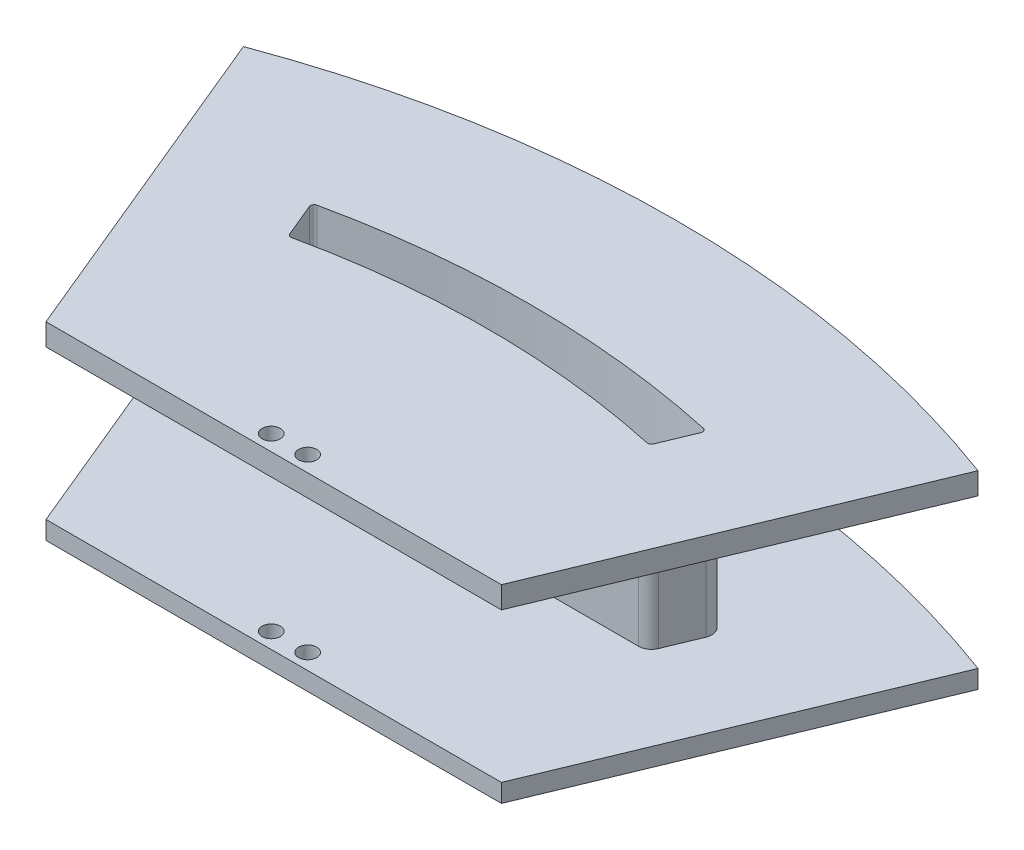
ISO-10303-21;
HEADER;
FILE_DESCRIPTION(('STEP AP214'),'2;1');
FILE_NAME('part.step','',(''),(''),'','','');
FILE_SCHEMA(('AUTOMOTIVE_DESIGN { 1 0 10303 214 1 1 1 1 }'));
ENDSEC;
DATA;
#1=APPLICATION_CONTEXT('core data for automotive mechanical design processes');
#2=APPLICATION_PROTOCOL_DEFINITION('international standard','automotive_design',2000,#1);
#3=PRODUCT_CONTEXT('',#1,'mechanical');
#4=PRODUCT('Part','Part','',(#3));
#5=PRODUCT_RELATED_PRODUCT_CATEGORY('part','',(#4));
#6=PRODUCT_DEFINITION_FORMATION('','',#4);
#7=PRODUCT_DEFINITION_CONTEXT('part definition',#1,'design');
#8=PRODUCT_DEFINITION('design','',#6,#7);
#9=PRODUCT_DEFINITION_SHAPE('','',#8);
#10=(LENGTH_UNIT() NAMED_UNIT(*) SI_UNIT(.MILLI.,.METRE.));
#11=(NAMED_UNIT(*) PLANE_ANGLE_UNIT() SI_UNIT($,.RADIAN.));
#12=(NAMED_UNIT(*) SI_UNIT($,.STERADIAN.) SOLID_ANGLE_UNIT());
#13=UNCERTAINTY_MEASURE_WITH_UNIT(LENGTH_MEASURE(1.E-05),#10,'distance_accuracy_value','');
#14=(GEOMETRIC_REPRESENTATION_CONTEXT(3) GLOBAL_UNCERTAINTY_ASSIGNED_CONTEXT((#13)) GLOBAL_UNIT_ASSIGNED_CONTEXT((#10,
#11,#12)) REPRESENTATION_CONTEXT('',''));
#15=CARTESIAN_POINT('',(0.,0.,0.));
#16=DIRECTION('',(0.,0.,1.));
#17=DIRECTION('',(1.,0.,0.));
#18=AXIS2_PLACEMENT_3D('',#15,#16,#17);
#19=CARTESIAN_POINT('',(0.,0.,-1.38777878078145E-13));
#20=DIRECTION('',(0.,-1.,0.));
#21=DIRECTION('',(0.,0.,-1.));
#22=AXIS2_PLACEMENT_3D('',#19,#20,#21);
#23=PLANE('',#22);
#24=CARTESIAN_POINT('',(0.,0.,-1.38777878078145E-13));
#25=DIRECTION('',(0.,-1.,0.));
#26=DIRECTION('',(0.,0.,-1.));
#27=AXIS2_PLACEMENT_3D('',#24,#25,#26);
#28=CIRCLE('',#27,145.);
#29=CARTESIAN_POINT('',(-50.404915860436,0.,-135.957141986371));
#30=VERTEX_POINT('',#29);
#31=CARTESIAN_POINT('',(50.404915860436,0.,-135.957141986371));
#32=VERTEX_POINT('',#31);
#33=EDGE_CURVE('E524',#30,#32,#28,.T.);
#34=ORIENTED_EDGE('',*,*,#33,.F.);
#35=DIRECTION('',(0.382683432365084,0.,0.92387953251129));
#36=VECTOR('',#35,1.);
#37=CARTESIAN_POINT('',(-50.404915860436,0.,-135.957141986371));
#38=LINE('',#37,#36);
#39=CARTESIAN_POINT('',(-31.25,0.,-89.7130843299906));
#40=VERTEX_POINT('',#39);
#41=EDGE_CURVE('E531',#30,#40,#38,.T.);
#42=ORIENTED_EDGE('',*,*,#41,.T.);
#43=DIRECTION('',(1.,0.,0.));
#44=VECTOR('',#43,1.);
#45=CARTESIAN_POINT('',(-31.25,0.,-89.7130843299906));
#46=LINE('',#45,#44);
#47=CARTESIAN_POINT('',(31.25,0.,-89.7130843299906));
#48=VERTEX_POINT('',#47);
#49=EDGE_CURVE('E545',#40,#48,#46,.T.);
#50=ORIENTED_EDGE('',*,*,#49,.T.);
#51=DIRECTION('',(-0.382683432365084,0.,0.92387953251129));
#52=VECTOR('',#51,1.);
#53=CARTESIAN_POINT('',(50.404915860436,0.,-135.957141986371));
#54=LINE('',#53,#52);
#55=EDGE_CURVE('E542',#32,#48,#54,.T.);
#56=ORIENTED_EDGE('',*,*,#55,.F.);
#57=EDGE_LOOP('',(#34,#42,#50,#56));
#58=FACE_BOUND('',#57,.T.);
#59=CARTESIAN_POINT('',(2.5,0.,-91.8683298050514));
#60=DIRECTION('',(0.,1.,0.));
#61=DIRECTION('',(0.,0.,1.));
#62=AXIS2_PLACEMENT_3D('',#59,#60,#61);
#63=CIRCLE('',#62,1.25);
#64=CARTESIAN_POINT('',(2.5,0.,-90.6183298050514));
#65=VERTEX_POINT('',#64);
#66=EDGE_CURVE('E520',#65,#65,#63,.F.);
#67=ORIENTED_EDGE('',*,*,#66,.T.);
#68=EDGE_LOOP('',(#67));
#69=FACE_BOUND('',#68,.T.);
#70=CARTESIAN_POINT('',(-2.5,0.,-91.8683298050514));
#71=DIRECTION('',(0.,1.,0.));
#72=DIRECTION('',(0.,0.,1.));
#73=AXIS2_PLACEMENT_3D('',#70,#71,#72);
#74=CIRCLE('',#73,1.25);
#75=CARTESIAN_POINT('',(-2.5,0.,-90.6183298050514));
#76=VERTEX_POINT('',#75);
#77=EDGE_CURVE('E479',#76,#76,#74,.T.);
#78=ORIENTED_EDGE('',*,*,#77,.F.);
#79=EDGE_LOOP('',(#78));
#80=FACE_BOUND('',#79,.T.);
#81=DIRECTION('',(0.382683432365085,0.,-0.923879532511289));
#82=VECTOR('',#81,1.);
#83=CARTESIAN_POINT('',(-18.857614350314,0.,-7.81107961790158));
#84=LINE('',#83,#82);
#85=CARTESIAN_POINT('',(26.112179792791,0.,-116.377766535313));
#86=VERTEX_POINT('',#85);
#87=CARTESIAN_POINT('',(28.0255969546164,0.,-120.99716419787));
#88=VERTEX_POINT('',#87);
#89=EDGE_CURVE('E221',#86,#88,#84,.T.);
#90=ORIENTED_EDGE('',*,*,#89,.F.);
#91=CARTESIAN_POINT('',(24.4953906108962,0.,-117.047462541952));
#92=DIRECTION('',(0.,-1.,0.));
#93=DIRECTION('',(0.,0.,-1.));
#94=AXIS2_PLACEMENT_3D('',#91,#92,#93);
#95=CIRCLE('',#94,1.75000000000001);
#96=CARTESIAN_POINT('',(24.4953906108962,0.,-115.297462541952));
#97=VERTEX_POINT('',#96);
#98=EDGE_CURVE('E558',#86,#97,#95,.T.);
#99=ORIENTED_EDGE('',*,*,#98,.T.);
#100=DIRECTION('',(-1.,0.,0.));
#101=VECTOR('',#100,1.);
#102=CARTESIAN_POINT('',(0.,0.,-115.297462541952));
#103=LINE('',#102,#101);
#104=CARTESIAN_POINT('',(-24.4953906108962,0.,-115.297462541952));
#105=VERTEX_POINT('',#104);
#106=EDGE_CURVE('E561',#97,#105,#103,.T.);
#107=ORIENTED_EDGE('',*,*,#106,.T.);
#108=CARTESIAN_POINT('',(-24.4953906108962,0.,-117.047462541952));
#109=DIRECTION('',(0.,-1.,0.));
#110=DIRECTION('',(0.,0.,-1.));
#111=AXIS2_PLACEMENT_3D('',#108,#109,#110);
#112=CIRCLE('',#111,1.75);
#113=CARTESIAN_POINT('',(-26.112179792791,0.,-116.377766535313));
#114=VERTEX_POINT('',#113);
#115=EDGE_CURVE('E564',#105,#114,#112,.T.);
#116=ORIENTED_EDGE('',*,*,#115,.T.);
#117=DIRECTION('',(-0.382683432365087,0.,-0.923879532511288));
#118=VECTOR('',#117,1.);
#119=CARTESIAN_POINT('',(18.8576143503142,0.,-7.81107961790172));
#120=LINE('',#119,#118);
#121=CARTESIAN_POINT('',(-28.0255969546164,0.,-120.99716419787));
#122=VERTEX_POINT('',#121);
#123=EDGE_CURVE('E567',#114,#122,#120,.T.);
#124=ORIENTED_EDGE('',*,*,#123,.T.);
#125=CARTESIAN_POINT('',(-26.4088077727217,0.,-121.666860204509));
#126=DIRECTION('',(0.,-1.,0.));
#127=DIRECTION('',(0.,0.,-1.));
#128=AXIS2_PLACEMENT_3D('',#125,#126,#127);
#129=CIRCLE('',#128,1.75);
#130=CARTESIAN_POINT('',(-26.7800159141053,0.,-123.377036954371));
#131=VERTEX_POINT('',#130);
#132=EDGE_CURVE('E570',#122,#131,#129,.T.);
#133=ORIENTED_EDGE('',*,*,#132,.T.);
#134=CARTESIAN_POINT('',(0.,0.,-1.38777878078145E-13));
#135=DIRECTION('',(0.,-1.,0.));
#136=DIRECTION('',(0.,0.,-1.));
#137=AXIS2_PLACEMENT_3D('',#134,#135,#136);
#138=CIRCLE('',#137,126.25);
#139=CARTESIAN_POINT('',(26.7800159141053,0.,-123.377036954371));
#140=VERTEX_POINT('',#139);
#141=EDGE_CURVE('E573',#131,#140,#138,.T.);
#142=ORIENTED_EDGE('',*,*,#141,.T.);
#143=CARTESIAN_POINT('',(26.4088077727216,0.,-121.666860204509));
#144=DIRECTION('',(0.,-1.,0.));
#145=DIRECTION('',(0.,0.,-1.));
#146=AXIS2_PLACEMENT_3D('',#143,#144,#145);
#147=CIRCLE('',#146,1.75);
#148=EDGE_CURVE('E576',#140,#88,#147,.T.);
#149=ORIENTED_EDGE('',*,*,#148,.T.);
#150=EDGE_LOOP('',(#90,#99,#107,#116,#124,#133,#142,#149));
#151=FACE_BOUND('',#150,.T.);
#152=ADVANCED_FACE('F213',(#58,#69,#80,#151),#23,.F.);
#153=CARTESIAN_POINT('',(0.,-2.5,-1.38777878078145E-13));
#154=DIRECTION('',(0.,-1.,0.));
#155=DIRECTION('',(0.,0.,-1.));
#156=AXIS2_PLACEMENT_3D('',#153,#154,#155);
#157=PLANE('',#156);
#158=CARTESIAN_POINT('',(0.,-2.5,-4.17485364670413));
#159=DIRECTION('',(0.,1.,0.));
#160=DIRECTION('',(0.,0.,1.));
#161=AXIS2_PLACEMENT_3D('',#158,#159,#160);
#162=CIRCLE('',#161,115.);
#163=CARTESIAN_POINT('',(24.389349958901,-2.5,-116.558836529419));
#164=VERTEX_POINT('',#163);
#165=CARTESIAN_POINT('',(-24.389349958901,-2.5,-116.558836529419));
#166=VERTEX_POINT('',#165);
#167=EDGE_CURVE('E487',#164,#166,#162,.T.);
#168=ORIENTED_EDGE('',*,*,#167,.F.);
#169=CARTESIAN_POINT('',(24.4953906108962,-2.5,-117.047462541952));
#170=DIRECTION('',(0.,-1.,0.));
#171=DIRECTION('',(0.,0.,-1.));
#172=AXIS2_PLACEMENT_3D('',#169,#170,#171);
#173=CIRCLE('',#172,0.499999999999993);
#174=CARTESIAN_POINT('',(24.9573303771519,-2.5,-116.85612082577));
#175=VERTEX_POINT('',#174);
#176=EDGE_CURVE('E483',#175,#164,#173,.T.);
#177=ORIENTED_EDGE('',*,*,#176,.F.);
#178=DIRECTION('',(-0.382683432365086,0.,0.923879532511288));
#179=VECTOR('',#178,1.);
#180=CARTESIAN_POINT('',(26.8707475389773,-2.5,-121.475518488326));
#181=LINE('',#180,#179);
#182=CARTESIAN_POINT('',(26.8707475389773,-2.5,-121.475518488326));
#183=VERTEX_POINT('',#182);
#184=EDGE_CURVE('E502',#183,#175,#181,.T.);
#185=ORIENTED_EDGE('',*,*,#184,.F.);
#186=CARTESIAN_POINT('',(26.4088077727216,-2.5,-121.666860204509));
#187=DIRECTION('',(0.,-1.,0.));
#188=DIRECTION('',(0.,0.,-1.));
#189=AXIS2_PLACEMENT_3D('',#186,#187,#188);
#190=CIRCLE('',#189,0.500000000000013);
#191=CARTESIAN_POINT('',(26.5148672416884,-2.5,-122.155482133041));
#192=VERTEX_POINT('',#191);
#193=EDGE_CURVE('E499',#192,#183,#190,.T.);
#194=ORIENTED_EDGE('',*,*,#193,.F.);
#195=CARTESIAN_POINT('',(0.,-2.5,-1.38777878078145E-13));
#196=DIRECTION('',(0.,-1.,0.));
#197=DIRECTION('',(0.,0.,-1.));
#198=AXIS2_PLACEMENT_3D('',#195,#196,#197);
#199=CIRCLE('',#198,125.);
#200=CARTESIAN_POINT('',(-26.5148672416884,-2.5,-122.155482133041));
#201=VERTEX_POINT('',#200);
#202=EDGE_CURVE('E497',#201,#192,#199,.T.);
#203=ORIENTED_EDGE('',*,*,#202,.F.);
#204=CARTESIAN_POINT('',(-26.4088077727217,-2.5,-121.666860204509));
#205=DIRECTION('',(0.,-1.,0.));
#206=DIRECTION('',(0.,0.,-1.));
#207=AXIS2_PLACEMENT_3D('',#204,#205,#206);
#208=CIRCLE('',#207,0.499999999999998);
#209=CARTESIAN_POINT('',(-26.8707475389773,-2.5,-121.475518488326));
#210=VERTEX_POINT('',#209);
#211=EDGE_CURVE('E495',#210,#201,#208,.T.);
#212=ORIENTED_EDGE('',*,*,#211,.F.);
#213=DIRECTION('',(0.382683432365085,0.,0.923879532511289));
#214=VECTOR('',#213,1.);
#215=CARTESIAN_POINT('',(-26.8707475389773,-2.5,-121.475518488326));
#216=LINE('',#215,#214);
#217=CARTESIAN_POINT('',(-24.9573303771519,-2.5,-116.85612082577));
#218=VERTEX_POINT('',#217);
#219=EDGE_CURVE('E492',#210,#218,#216,.T.);
#220=ORIENTED_EDGE('',*,*,#219,.T.);
#221=CARTESIAN_POINT('',(-24.4953906108962,-2.5,-117.047462541952));
#222=DIRECTION('',(0.,1.,0.));
#223=DIRECTION('',(0.,0.,1.));
#224=AXIS2_PLACEMENT_3D('',#221,#222,#223);
#225=CIRCLE('',#224,0.49999999999999);
#226=EDGE_CURVE('E489',#218,#166,#225,.T.);
#227=ORIENTED_EDGE('',*,*,#226,.T.);
#228=EDGE_LOOP('',(#168,#177,#185,#194,#203,#212,#220,#227));
#229=FACE_BOUND('',#228,.T.);
#230=CARTESIAN_POINT('',(2.5,-2.5,-91.8683298050514));
#231=DIRECTION('',(0.,1.,0.));
#232=DIRECTION('',(0.,0.,1.));
#233=AXIS2_PLACEMENT_3D('',#230,#231,#232);
#234=CIRCLE('',#233,1.25);
#235=CARTESIAN_POINT('',(2.5,-2.5,-90.6183298050514));
#236=VERTEX_POINT('',#235);
#237=EDGE_CURVE('E521',#236,#236,#234,.F.);
#238=ORIENTED_EDGE('',*,*,#237,.F.);
#239=EDGE_LOOP('',(#238));
#240=FACE_BOUND('',#239,.T.);
#241=CARTESIAN_POINT('',(0.,-2.5,-1.38777878078145E-13));
#242=DIRECTION('',(0.,-1.,0.));
#243=DIRECTION('',(0.,0.,-1.));
#244=AXIS2_PLACEMENT_3D('',#241,#242,#243);
#245=CIRCLE('',#244,145.);
#246=CARTESIAN_POINT('',(-50.404915860436,-2.5,-135.957141986371));
#247=VERTEX_POINT('',#246);
#248=CARTESIAN_POINT('',(50.404915860436,-2.5,-135.957141986371));
#249=VERTEX_POINT('',#248);
#250=EDGE_CURVE('E527',#247,#249,#245,.T.);
#251=ORIENTED_EDGE('',*,*,#250,.T.);
#252=DIRECTION('',(-0.382683432365084,0.,0.92387953251129));
#253=VECTOR('',#252,1.);
#254=CARTESIAN_POINT('',(50.404915860436,-2.5,-135.957141986371));
#255=LINE('',#254,#253);
#256=CARTESIAN_POINT('',(31.25,-2.5,-89.7130843299906));
#257=VERTEX_POINT('',#256);
#258=EDGE_CURVE('E530',#249,#257,#255,.T.);
#259=ORIENTED_EDGE('',*,*,#258,.T.);
#260=DIRECTION('',(1.,0.,0.));
#261=VECTOR('',#260,1.);
#262=CARTESIAN_POINT('',(-31.25,-2.5,-89.7130843299906));
#263=LINE('',#262,#261);
#264=CARTESIAN_POINT('',(-31.25,-2.5,-89.7130843299906));
#265=VERTEX_POINT('',#264);
#266=EDGE_CURVE('E533',#265,#257,#263,.T.);
#267=ORIENTED_EDGE('',*,*,#266,.F.);
#268=DIRECTION('',(0.382683432365084,0.,0.92387953251129));
#269=VECTOR('',#268,1.);
#270=CARTESIAN_POINT('',(-50.404915860436,-2.5,-135.957141986371));
#271=LINE('',#270,#269);
#272=EDGE_CURVE('E536',#247,#265,#271,.T.);
#273=ORIENTED_EDGE('',*,*,#272,.F.);
#274=EDGE_LOOP('',(#251,#259,#267,#273));
#275=FACE_BOUND('',#274,.T.);
#276=CARTESIAN_POINT('',(-2.5,-2.5,-91.8683298050514));
#277=DIRECTION('',(0.,1.,0.));
#278=DIRECTION('',(0.,0.,1.));
#279=AXIS2_PLACEMENT_3D('',#276,#277,#278);
#280=CIRCLE('',#279,1.25);
#281=CARTESIAN_POINT('',(-2.5,-2.5,-90.6183298050514));
#282=VERTEX_POINT('',#281);
#283=EDGE_CURVE('E480',#282,#282,#280,.T.);
#284=ORIENTED_EDGE('',*,*,#283,.T.);
#285=EDGE_LOOP('',(#284));
#286=FACE_BOUND('',#285,.T.);
#287=ADVANCED_FACE('F617',(#229,#240,#275,#286),#157,.T.);
#288=CARTESIAN_POINT('',(0.,-2.5,-1.38777878078145E-13));
#289=DIRECTION('',(0.,1.,0.));
#290=DIRECTION('',(0.,0.,1.));
#291=AXIS2_PLACEMENT_3D('',#288,#289,#290);
#292=CYLINDRICAL_SURFACE('',#291,145.);
#293=ORIENTED_EDGE('',*,*,#33,.T.);
#294=DIRECTION('',(0.,1.,0.));
#295=VECTOR('',#294,1.);
#296=CARTESIAN_POINT('',(50.404915860436,-2.5,-135.957141986371));
#297=LINE('',#296,#295);
#298=EDGE_CURVE('E555',#249,#32,#297,.T.);
#299=ORIENTED_EDGE('',*,*,#298,.F.);
#300=ORIENTED_EDGE('',*,*,#250,.F.);
#301=DIRECTION('',(0.,1.,0.));
#302=VECTOR('',#301,1.);
#303=CARTESIAN_POINT('',(-50.404915860436,-2.5,-135.957141986371));
#304=LINE('',#303,#302);
#305=EDGE_CURVE('E539',#247,#30,#304,.T.);
#306=ORIENTED_EDGE('',*,*,#305,.T.);
#307=EDGE_LOOP('',(#293,#299,#300,#306));
#308=FACE_BOUND('',#307,.T.);
#309=ADVANCED_FACE('F215',(#308),#292,.T.);
#310=CARTESIAN_POINT('',(50.404915860436,-2.5,-135.957141986371));
#311=DIRECTION('',(-0.923879532511289,0.,-0.382683432365084));
#312=DIRECTION('',(-0.382683432365084,0.,0.923879532511289));
#313=AXIS2_PLACEMENT_3D('',#310,#311,#312);
#314=PLANE('',#313);
#315=ORIENTED_EDGE('',*,*,#55,.T.);
#316=DIRECTION('',(0.,1.,0.));
#317=VECTOR('',#316,1.);
#318=CARTESIAN_POINT('',(31.25,-2.5,-89.7130843299906));
#319=LINE('',#318,#317);
#320=EDGE_CURVE('E553',#257,#48,#319,.T.);
#321=ORIENTED_EDGE('',*,*,#320,.F.);
#322=ORIENTED_EDGE('',*,*,#258,.F.);
#323=ORIENTED_EDGE('',*,*,#298,.T.);
#324=EDGE_LOOP('',(#315,#321,#322,#323));
#325=FACE_BOUND('',#324,.T.);
#326=ADVANCED_FACE('F636',(#325),#314,.F.);
#327=CARTESIAN_POINT('',(-31.25,-2.5,-89.7130843299906));
#328=DIRECTION('',(0.,0.,1.));
#329=DIRECTION('',(1.,0.,0.));
#330=AXIS2_PLACEMENT_3D('',#327,#328,#329);
#331=PLANE('',#330);
#332=ORIENTED_EDGE('',*,*,#49,.F.);
#333=DIRECTION('',(0.,1.,0.));
#334=VECTOR('',#333,1.);
#335=CARTESIAN_POINT('',(-31.25,-2.5,-89.7130843299906));
#336=LINE('',#335,#334);
#337=EDGE_CURVE('E551',#265,#40,#336,.T.);
#338=ORIENTED_EDGE('',*,*,#337,.F.);
#339=ORIENTED_EDGE('',*,*,#266,.T.);
#340=ORIENTED_EDGE('',*,*,#320,.T.);
#341=EDGE_LOOP('',(#332,#338,#339,#340));
#342=FACE_BOUND('',#341,.T.);
#343=ADVANCED_FACE('F633',(#342),#331,.T.);
#344=CARTESIAN_POINT('',(-50.404915860436,-2.5,-135.957141986371));
#345=DIRECTION('',(-0.923879532511289,0.,0.382683432365084));
#346=DIRECTION('',(0.382683432365084,0.,0.923879532511289));
#347=AXIS2_PLACEMENT_3D('',#344,#345,#346);
#348=PLANE('',#347);
#349=ORIENTED_EDGE('',*,*,#41,.F.);
#350=ORIENTED_EDGE('',*,*,#305,.F.);
#351=ORIENTED_EDGE('',*,*,#272,.T.);
#352=ORIENTED_EDGE('',*,*,#337,.T.);
#353=EDGE_LOOP('',(#349,#350,#351,#352));
#354=FACE_BOUND('',#353,.T.);
#355=ADVANCED_FACE('F629',(#354),#348,.T.);
#356=CARTESIAN_POINT('',(2.5,-2.5,-91.8683298050514));
#357=DIRECTION('',(0.,1.,0.));
#358=DIRECTION('',(0.,0.,1.));
#359=AXIS2_PLACEMENT_3D('',#356,#357,#358);
#360=CYLINDRICAL_SURFACE('',#359,1.25);
#361=ORIENTED_EDGE('',*,*,#237,.T.);
#362=EDGE_LOOP('',(#361));
#363=FACE_BOUND('',#362,.T.);
#364=ORIENTED_EDGE('',*,*,#66,.F.);
#365=EDGE_LOOP('',(#364));
#366=FACE_BOUND('',#365,.T.);
#367=ADVANCED_FACE('F632',(#363,#366),#360,.F.);
#368=CARTESIAN_POINT('',(24.4953906108962,-2.5,-117.047462541952));
#369=DIRECTION('',(0.,1.,0.));
#370=DIRECTION('',(0.,0.,1.));
#371=AXIS2_PLACEMENT_3D('',#368,#369,#370);
#372=CYLINDRICAL_SURFACE('',#371,0.499999999999993);
#373=DIRECTION('',(0.,1.,0.));
#374=VECTOR('',#373,1.);
#375=CARTESIAN_POINT('',(24.389349958901,-2.5,-116.558836529419));
#376=LINE('',#375,#374);
#377=CARTESIAN_POINT('',(24.389349958901,23.5,-116.558836529419));
#378=VERTEX_POINT('',#377);
#379=EDGE_CURVE('E518',#164,#378,#376,.T.);
#380=ORIENTED_EDGE('',*,*,#379,.T.);
#381=CARTESIAN_POINT('',(24.4953906108962,23.5,-117.047462541952));
#382=DIRECTION('',(0.,-1.,0.));
#383=DIRECTION('',(0.,0.,-1.));
#384=AXIS2_PLACEMENT_3D('',#381,#382,#383);
#385=CIRCLE('',#384,0.499999999999993);
#386=CARTESIAN_POINT('',(24.9573303771519,23.5,-116.85612082577));
#387=VERTEX_POINT('',#386);
#388=EDGE_CURVE('E442',#387,#378,#385,.T.);
#389=ORIENTED_EDGE('',*,*,#388,.F.);
#390=DIRECTION('',(0.,1.,0.));
#391=VECTOR('',#390,1.);
#392=CARTESIAN_POINT('',(24.9573303771519,-2.5,-116.85612082577));
#393=LINE('',#392,#391);
#394=EDGE_CURVE('E504',#175,#387,#393,.T.);
#395=ORIENTED_EDGE('',*,*,#394,.F.);
#396=ORIENTED_EDGE('',*,*,#176,.T.);
#397=EDGE_LOOP('',(#380,#389,#395,#396));
#398=FACE_BOUND('',#397,.T.);
#399=ADVANCED_FACE('F693',(#398),#372,.F.);
#400=CARTESIAN_POINT('',(0.,-2.5,-4.17485364670413));
#401=DIRECTION('',(0.,1.,0.));
#402=DIRECTION('',(0.,0.,1.));
#403=AXIS2_PLACEMENT_3D('',#400,#401,#402);
#404=CYLINDRICAL_SURFACE('',#403,115.);
#405=DIRECTION('',(0.,1.,0.));
#406=VECTOR('',#405,1.);
#407=CARTESIAN_POINT('',(-24.389349958901,-2.5,-116.558836529419));
#408=LINE('',#407,#406);
#409=CARTESIAN_POINT('',(-24.389349958901,23.5,-116.558836529419));
#410=VERTEX_POINT('',#409);
#411=EDGE_CURVE('E516',#166,#410,#408,.T.);
#412=ORIENTED_EDGE('',*,*,#411,.T.);
#413=CARTESIAN_POINT('',(0.,23.5,-4.17485364670413));
#414=DIRECTION('',(0.,-1.,0.));
#415=DIRECTION('',(0.,0.,-1.));
#416=AXIS2_PLACEMENT_3D('',#413,#414,#415);
#417=CIRCLE('',#416,115.);
#418=EDGE_CURVE('E439',#410,#378,#417,.T.);
#419=ORIENTED_EDGE('',*,*,#418,.T.);
#420=ORIENTED_EDGE('',*,*,#379,.F.);
#421=ORIENTED_EDGE('',*,*,#167,.T.);
#422=EDGE_LOOP('',(#412,#419,#420,#421));
#423=FACE_BOUND('',#422,.T.);
#424=ADVANCED_FACE('F689',(#423),#404,.T.);
#425=CARTESIAN_POINT('',(-24.4953906108962,-2.5,-117.047462541952));
#426=DIRECTION('',(0.,1.,0.));
#427=DIRECTION('',(0.,0.,1.));
#428=AXIS2_PLACEMENT_3D('',#425,#426,#427);
#429=CYLINDRICAL_SURFACE('',#428,0.49999999999999);
#430=DIRECTION('',(0.,1.,0.));
#431=VECTOR('',#430,1.);
#432=CARTESIAN_POINT('',(-24.9573303771519,-2.5,-116.85612082577));
#433=LINE('',#432,#431);
#434=CARTESIAN_POINT('',(-24.9573303771519,23.5,-116.85612082577));
#435=VERTEX_POINT('',#434);
#436=EDGE_CURVE('E514',#218,#435,#433,.T.);
#437=ORIENTED_EDGE('',*,*,#436,.T.);
#438=CARTESIAN_POINT('',(-24.4953906108962,23.5,-117.047462541952));
#439=DIRECTION('',(0.,-1.,0.));
#440=DIRECTION('',(0.,0.,-1.));
#441=AXIS2_PLACEMENT_3D('',#438,#439,#440);
#442=CIRCLE('',#441,0.49999999999999);
#443=EDGE_CURVE('E460',#410,#435,#442,.T.);
#444=ORIENTED_EDGE('',*,*,#443,.F.);
#445=ORIENTED_EDGE('',*,*,#411,.F.);
#446=ORIENTED_EDGE('',*,*,#226,.F.);
#447=EDGE_LOOP('',(#437,#444,#445,#446));
#448=FACE_BOUND('',#447,.T.);
#449=ADVANCED_FACE('F685',(#448),#429,.F.);
#450=CARTESIAN_POINT('',(-26.8707475389773,-2.5,-121.475518488326));
#451=DIRECTION('',(-0.923879532511289,0.,0.382683432365085));
#452=DIRECTION('',(0.382683432365085,0.,0.923879532511289));
#453=AXIS2_PLACEMENT_3D('',#450,#451,#452);
#454=PLANE('',#453);
#455=DIRECTION('',(0.,1.,0.));
#456=VECTOR('',#455,1.);
#457=CARTESIAN_POINT('',(-26.8707475389773,-2.5,-121.475518488326));
#458=LINE('',#457,#456);
#459=CARTESIAN_POINT('',(-26.8707475389773,23.5,-121.475518488326));
#460=VERTEX_POINT('',#459);
#461=EDGE_CURVE('E512',#210,#460,#458,.T.);
#462=ORIENTED_EDGE('',*,*,#461,.T.);
#463=DIRECTION('',(-0.382683432365086,0.,-0.923879532511289));
#464=VECTOR('',#463,1.);
#465=CARTESIAN_POINT('',(20.0124637659531,23.5,-8.28943390835795));
#466=LINE('',#465,#464);
#467=EDGE_CURVE('E457',#435,#460,#466,.T.);
#468=ORIENTED_EDGE('',*,*,#467,.F.);
#469=ORIENTED_EDGE('',*,*,#436,.F.);
#470=ORIENTED_EDGE('',*,*,#219,.F.);
#471=EDGE_LOOP('',(#462,#468,#469,#470));
#472=FACE_BOUND('',#471,.T.);
#473=ADVANCED_FACE('F681',(#472),#454,.F.);
#474=CARTESIAN_POINT('',(-26.4088077727217,-2.5,-121.666860204509));
#475=DIRECTION('',(0.,1.,0.));
#476=DIRECTION('',(0.,0.,1.));
#477=AXIS2_PLACEMENT_3D('',#474,#475,#476);
#478=CYLINDRICAL_SURFACE('',#477,0.499999999999998);
#479=DIRECTION('',(0.,1.,0.));
#480=VECTOR('',#479,1.);
#481=CARTESIAN_POINT('',(-26.5148672416884,-2.5,-122.155482133041));
#482=LINE('',#481,#480);
#483=CARTESIAN_POINT('',(-26.5148672416884,23.5,-122.155482133041));
#484=VERTEX_POINT('',#483);
#485=EDGE_CURVE('E510',#201,#484,#482,.T.);
#486=ORIENTED_EDGE('',*,*,#485,.T.);
#487=CARTESIAN_POINT('',(-26.4088077727217,23.5,-121.666860204509));
#488=DIRECTION('',(0.,-1.,0.));
#489=DIRECTION('',(0.,0.,-1.));
#490=AXIS2_PLACEMENT_3D('',#487,#488,#489);
#491=CIRCLE('',#490,0.499999999999998);
#492=EDGE_CURVE('E454',#460,#484,#491,.T.);
#493=ORIENTED_EDGE('',*,*,#492,.F.);
#494=ORIENTED_EDGE('',*,*,#461,.F.);
#495=ORIENTED_EDGE('',*,*,#211,.T.);
#496=EDGE_LOOP('',(#486,#493,#494,#495));
#497=FACE_BOUND('',#496,.T.);
#498=ADVANCED_FACE('F677',(#497),#478,.F.);
#499=CARTESIAN_POINT('',(0.,-2.5,-1.38777878078145E-13));
#500=DIRECTION('',(0.,1.,0.));
#501=DIRECTION('',(0.,0.,1.));
#502=AXIS2_PLACEMENT_3D('',#499,#500,#501);
#503=CYLINDRICAL_SURFACE('',#502,125.);
#504=DIRECTION('',(0.,1.,0.));
#505=VECTOR('',#504,1.);
#506=CARTESIAN_POINT('',(26.5148672416884,-2.5,-122.155482133041));
#507=LINE('',#506,#505);
#508=CARTESIAN_POINT('',(26.5148672416884,23.5,-122.155482133041));
#509=VERTEX_POINT('',#508);
#510=EDGE_CURVE('E508',#192,#509,#507,.T.);
#511=ORIENTED_EDGE('',*,*,#510,.T.);
#512=CARTESIAN_POINT('',(0.,23.5,-1.38777878078145E-13));
#513=DIRECTION('',(0.,-1.,0.));
#514=DIRECTION('',(0.,0.,-1.));
#515=AXIS2_PLACEMENT_3D('',#512,#513,#514);
#516=CIRCLE('',#515,125.);
#517=EDGE_CURVE('E451',#484,#509,#516,.T.);
#518=ORIENTED_EDGE('',*,*,#517,.F.);
#519=ORIENTED_EDGE('',*,*,#485,.F.);
#520=ORIENTED_EDGE('',*,*,#202,.T.);
#521=EDGE_LOOP('',(#511,#518,#519,#520));
#522=FACE_BOUND('',#521,.T.);
#523=ADVANCED_FACE('F673',(#522),#503,.F.);
#524=CARTESIAN_POINT('',(26.4088077727216,-2.5,-121.666860204509));
#525=DIRECTION('',(0.,1.,0.));
#526=DIRECTION('',(0.,0.,1.));
#527=AXIS2_PLACEMENT_3D('',#524,#525,#526);
#528=CYLINDRICAL_SURFACE('',#527,0.500000000000013);
#529=DIRECTION('',(0.,1.,0.));
#530=VECTOR('',#529,1.);
#531=CARTESIAN_POINT('',(26.8707475389773,-2.5,-121.475518488326));
#532=LINE('',#531,#530);
#533=CARTESIAN_POINT('',(26.8707475389773,23.5,-121.475518488326));
#534=VERTEX_POINT('',#533);
#535=EDGE_CURVE('E506',#183,#534,#532,.T.);
#536=ORIENTED_EDGE('',*,*,#535,.T.);
#537=CARTESIAN_POINT('',(26.4088077727216,23.5,-121.666860204509));
#538=DIRECTION('',(0.,-1.,0.));
#539=DIRECTION('',(0.,0.,-1.));
#540=AXIS2_PLACEMENT_3D('',#537,#538,#539);
#541=CIRCLE('',#540,0.500000000000013);
#542=EDGE_CURVE('E448',#509,#534,#541,.T.);
#543=ORIENTED_EDGE('',*,*,#542,.F.);
#544=ORIENTED_EDGE('',*,*,#510,.F.);
#545=ORIENTED_EDGE('',*,*,#193,.T.);
#546=EDGE_LOOP('',(#536,#543,#544,#545));
#547=FACE_BOUND('',#546,.T.);
#548=ADVANCED_FACE('F667',(#547),#528,.F.);
#549=CARTESIAN_POINT('',(26.8707475389773,-2.5,-121.475518488326));
#550=DIRECTION('',(-0.923879532511288,0.,-0.382683432365086));
#551=DIRECTION('',(-0.382683432365086,0.,0.923879532511288));
#552=AXIS2_PLACEMENT_3D('',#549,#550,#551);
#553=PLANE('',#552);
#554=ORIENTED_EDGE('',*,*,#394,.T.);
#555=DIRECTION('',(0.382683432365086,0.,-0.923879532511289));
#556=VECTOR('',#555,1.);
#557=CARTESIAN_POINT('',(-20.0124637659531,23.5,-8.28943390835797));
#558=LINE('',#557,#556);
#559=EDGE_CURVE('E445',#387,#534,#558,.T.);
#560=ORIENTED_EDGE('',*,*,#559,.T.);
#561=ORIENTED_EDGE('',*,*,#535,.F.);
#562=ORIENTED_EDGE('',*,*,#184,.T.);
#563=EDGE_LOOP('',(#554,#560,#561,#562));
#564=FACE_BOUND('',#563,.T.);
#565=ADVANCED_FACE('F658',(#564),#553,.T.);
#566=CARTESIAN_POINT('',(-2.5,-2.5,-91.8683298050514));
#567=DIRECTION('',(0.,1.,0.));
#568=DIRECTION('',(0.,0.,1.));
#569=AXIS2_PLACEMENT_3D('',#566,#567,#568);
#570=CYLINDRICAL_SURFACE('',#569,1.25);
#571=ORIENTED_EDGE('',*,*,#283,.F.);
#572=EDGE_LOOP('',(#571));
#573=FACE_BOUND('',#572,.T.);
#574=ORIENTED_EDGE('',*,*,#77,.T.);
#575=EDGE_LOOP('',(#574));
#576=FACE_BOUND('',#575,.T.);
#577=ADVANCED_FACE('F655',(#573,#576),#570,.F.);
#578=CARTESIAN_POINT('',(-18.857614350314,23.5,-7.81107961790157));
#579=DIRECTION('',(-0.923879532511289,0.,-0.382683432365085));
#580=DIRECTION('',(-0.382683432365085,0.,0.923879532511289));
#581=AXIS2_PLACEMENT_3D('',#578,#579,#580);
#582=PLANE('',#581);
#583=DIRECTION('',(0.,-1.,0.));
#584=VECTOR('',#583,1.);
#585=CARTESIAN_POINT('',(28.0255969546164,23.5,-120.99716419787));
#586=LINE('',#585,#584);
#587=CARTESIAN_POINT('',(28.0255969546164,20.5,-120.99716419787));
#588=VERTEX_POINT('',#587);
#589=EDGE_CURVE('E477',#588,#88,#586,.T.);
#590=ORIENTED_EDGE('',*,*,#589,.F.);
#591=DIRECTION('',(-0.382683432365085,0.,0.923879532511289));
#592=VECTOR('',#591,1.);
#593=CARTESIAN_POINT('',(-18.857614350314,20.5,-7.81107961790157));
#594=LINE('',#593,#592);
#595=CARTESIAN_POINT('',(26.112179792791,20.5,-116.377766535313));
#596=VERTEX_POINT('',#595);
#597=EDGE_CURVE('E436',#588,#596,#594,.T.);
#598=ORIENTED_EDGE('',*,*,#597,.T.);
#599=DIRECTION('',(0.,-1.,0.));
#600=VECTOR('',#599,1.);
#601=CARTESIAN_POINT('',(26.112179792791,23.5,-116.377766535313));
#602=LINE('',#601,#600);
#603=EDGE_CURVE('E463',#596,#86,#602,.T.);
#604=ORIENTED_EDGE('',*,*,#603,.T.);
#605=ORIENTED_EDGE('',*,*,#89,.T.);
#606=EDGE_LOOP('',(#590,#598,#604,#605));
#607=FACE_BOUND('',#606,.T.);
#608=ADVANCED_FACE('F581',(#607),#582,.F.);
#609=CARTESIAN_POINT('',(26.4088077727216,23.5,-121.666860204509));
#610=DIRECTION('',(0.,-1.,0.));
#611=DIRECTION('',(0.,0.,-1.));
#612=AXIS2_PLACEMENT_3D('',#609,#610,#611);
#613=CYLINDRICAL_SURFACE('',#612,1.75);
#614=CARTESIAN_POINT('',(26.4088077727216,20.5,-121.666860204509));
#615=DIRECTION('',(0.,-1.,0.));
#616=DIRECTION('',(0.,0.,-1.));
#617=AXIS2_PLACEMENT_3D('',#614,#615,#616);
#618=CIRCLE('',#617,1.75);
#619=CARTESIAN_POINT('',(26.7800159141053,20.5,-123.377036954371));
#620=VERTEX_POINT('',#619);
#621=EDGE_CURVE('E228',#588,#620,#618,.F.);
#622=ORIENTED_EDGE('',*,*,#621,.F.);
#623=ORIENTED_EDGE('',*,*,#589,.T.);
#624=ORIENTED_EDGE('',*,*,#148,.F.);
#625=DIRECTION('',(0.,-1.,0.));
#626=VECTOR('',#625,1.);
#627=CARTESIAN_POINT('',(26.7800159141053,23.5,-123.377036954371));
#628=LINE('',#627,#626);
#629=EDGE_CURVE('E475',#620,#140,#628,.T.);
#630=ORIENTED_EDGE('',*,*,#629,.F.);
#631=EDGE_LOOP('',(#622,#623,#624,#630));
#632=FACE_BOUND('',#631,.T.);
#633=ADVANCED_FACE('F587',(#632),#613,.T.);
#634=CARTESIAN_POINT('',(0.,23.5,-1.38777878078145E-13));
#635=DIRECTION('',(0.,-1.,0.));
#636=DIRECTION('',(0.,0.,-1.));
#637=AXIS2_PLACEMENT_3D('',#634,#635,#636);
#638=CYLINDRICAL_SURFACE('',#637,126.25);
#639=CARTESIAN_POINT('',(0.,20.5,-1.38777878078145E-13));
#640=DIRECTION('',(0.,-1.,0.));
#641=DIRECTION('',(0.,0.,-1.));
#642=AXIS2_PLACEMENT_3D('',#639,#640,#641);
#643=CIRCLE('',#642,126.25);
#644=CARTESIAN_POINT('',(-26.7800159141053,20.5,-123.377036954371));
#645=VERTEX_POINT('',#644);
#646=EDGE_CURVE('E236',#620,#645,#643,.F.);
#647=ORIENTED_EDGE('',*,*,#646,.F.);
#648=ORIENTED_EDGE('',*,*,#629,.T.);
#649=ORIENTED_EDGE('',*,*,#141,.F.);
#650=DIRECTION('',(0.,-1.,0.));
#651=VECTOR('',#650,1.);
#652=CARTESIAN_POINT('',(-26.7800159141053,23.5,-123.377036954371));
#653=LINE('',#652,#651);
#654=EDGE_CURVE('E473',#645,#131,#653,.T.);
#655=ORIENTED_EDGE('',*,*,#654,.F.);
#656=EDGE_LOOP('',(#647,#648,#649,#655));
#657=FACE_BOUND('',#656,.T.);
#658=ADVANCED_FACE('F607',(#657),#638,.T.);
#659=CARTESIAN_POINT('',(-26.4088077727217,23.5,-121.666860204509));
#660=DIRECTION('',(0.,-1.,0.));
#661=DIRECTION('',(0.,0.,-1.));
#662=AXIS2_PLACEMENT_3D('',#659,#660,#661);
#663=CYLINDRICAL_SURFACE('',#662,1.75);
#664=CARTESIAN_POINT('',(-26.4088077727217,20.5,-121.666860204509));
#665=DIRECTION('',(0.,-1.,0.));
#666=DIRECTION('',(0.,0.,-1.));
#667=AXIS2_PLACEMENT_3D('',#664,#665,#666);
#668=CIRCLE('',#667,1.75);
#669=CARTESIAN_POINT('',(-28.0255969546164,20.5,-120.99716419787));
#670=VERTEX_POINT('',#669);
#671=EDGE_CURVE('E431',#645,#670,#668,.F.);
#672=ORIENTED_EDGE('',*,*,#671,.F.);
#673=ORIENTED_EDGE('',*,*,#654,.T.);
#674=ORIENTED_EDGE('',*,*,#132,.F.);
#675=DIRECTION('',(0.,-1.,0.));
#676=VECTOR('',#675,1.);
#677=CARTESIAN_POINT('',(-28.0255969546164,23.5,-120.99716419787));
#678=LINE('',#677,#676);
#679=EDGE_CURVE('E471',#670,#122,#678,.T.);
#680=ORIENTED_EDGE('',*,*,#679,.F.);
#681=EDGE_LOOP('',(#672,#673,#674,#680));
#682=FACE_BOUND('',#681,.T.);
#683=ADVANCED_FACE('F606',(#682),#663,.T.);
#684=CARTESIAN_POINT('',(18.8576143503142,23.5,-7.81107961790172));
#685=DIRECTION('',(-0.923879532511288,0.,0.382683432365087));
#686=DIRECTION('',(0.382683432365087,0.,0.923879532511288));
#687=AXIS2_PLACEMENT_3D('',#684,#685,#686);
#688=PLANE('',#687);
#689=DIRECTION('',(0.382683432365087,0.,0.923879532511288));
#690=VECTOR('',#689,1.);
#691=CARTESIAN_POINT('',(18.8576143503142,20.5,-7.81107961790172));
#692=LINE('',#691,#690);
#693=CARTESIAN_POINT('',(-26.112179792791,20.5,-116.377766535313));
#694=VERTEX_POINT('',#693);
#695=EDGE_CURVE('E428',#670,#694,#692,.T.);
#696=ORIENTED_EDGE('',*,*,#695,.F.);
#697=ORIENTED_EDGE('',*,*,#679,.T.);
#698=ORIENTED_EDGE('',*,*,#123,.F.);
#699=DIRECTION('',(0.,-1.,0.));
#700=VECTOR('',#699,1.);
#701=CARTESIAN_POINT('',(-26.112179792791,23.5,-116.377766535313));
#702=LINE('',#701,#700);
#703=EDGE_CURVE('E469',#694,#114,#702,.T.);
#704=ORIENTED_EDGE('',*,*,#703,.F.);
#705=EDGE_LOOP('',(#696,#697,#698,#704));
#706=FACE_BOUND('',#705,.T.);
#707=ADVANCED_FACE('F602',(#706),#688,.T.);
#708=CARTESIAN_POINT('',(-24.4953906108962,23.5,-117.047462541952));
#709=DIRECTION('',(0.,-1.,0.));
#710=DIRECTION('',(0.,0.,-1.));
#711=AXIS2_PLACEMENT_3D('',#708,#709,#710);
#712=CYLINDRICAL_SURFACE('',#711,1.75);
#713=CARTESIAN_POINT('',(-24.4953906108962,20.5,-117.047462541952));
#714=DIRECTION('',(0.,-1.,0.));
#715=DIRECTION('',(0.,0.,-1.));
#716=AXIS2_PLACEMENT_3D('',#713,#714,#715);
#717=CIRCLE('',#716,1.75);
#718=CARTESIAN_POINT('',(-24.4953906108962,20.5,-115.297462541952));
#719=VERTEX_POINT('',#718);
#720=EDGE_CURVE('E425',#694,#719,#717,.F.);
#721=ORIENTED_EDGE('',*,*,#720,.F.);
#722=ORIENTED_EDGE('',*,*,#703,.T.);
#723=ORIENTED_EDGE('',*,*,#115,.F.);
#724=DIRECTION('',(0.,-1.,0.));
#725=VECTOR('',#724,1.);
#726=CARTESIAN_POINT('',(-24.4953906108962,23.5,-115.297462541952));
#727=LINE('',#726,#725);
#728=EDGE_CURVE('E467',#719,#105,#727,.T.);
#729=ORIENTED_EDGE('',*,*,#728,.F.);
#730=EDGE_LOOP('',(#721,#722,#723,#729));
#731=FACE_BOUND('',#730,.T.);
#732=ADVANCED_FACE('F599',(#731),#712,.T.);
#733=CARTESIAN_POINT('',(0.,23.5,-115.297462541952));
#734=DIRECTION('',(0.,0.,1.));
#735=DIRECTION('',(1.,0.,0.));
#736=AXIS2_PLACEMENT_3D('',#733,#734,#735);
#737=PLANE('',#736);
#738=DIRECTION('',(1.,0.,0.));
#739=VECTOR('',#738,1.);
#740=CARTESIAN_POINT('',(0.,20.5,-115.297462541952));
#741=LINE('',#740,#739);
#742=CARTESIAN_POINT('',(24.4953906108962,20.5,-115.297462541952));
#743=VERTEX_POINT('',#742);
#744=EDGE_CURVE('E419',#719,#743,#741,.T.);
#745=ORIENTED_EDGE('',*,*,#744,.F.);
#746=ORIENTED_EDGE('',*,*,#728,.T.);
#747=ORIENTED_EDGE('',*,*,#106,.F.);
#748=DIRECTION('',(0.,-1.,0.));
#749=VECTOR('',#748,1.);
#750=CARTESIAN_POINT('',(24.4953906108962,23.5,-115.297462541952));
#751=LINE('',#750,#749);
#752=EDGE_CURVE('E465',#743,#97,#751,.T.);
#753=ORIENTED_EDGE('',*,*,#752,.F.);
#754=EDGE_LOOP('',(#745,#746,#747,#753));
#755=FACE_BOUND('',#754,.T.);
#756=ADVANCED_FACE('F594',(#755),#737,.T.);
#757=CARTESIAN_POINT('',(24.4953906108962,23.5,-117.047462541952));
#758=DIRECTION('',(0.,-1.,0.));
#759=DIRECTION('',(0.,0.,-1.));
#760=AXIS2_PLACEMENT_3D('',#757,#758,#759);
#761=CYLINDRICAL_SURFACE('',#760,1.75000000000001);
#762=CARTESIAN_POINT('',(24.4953906108962,20.5,-117.047462541952));
#763=DIRECTION('',(0.,-1.,0.));
#764=DIRECTION('',(0.,0.,-1.));
#765=AXIS2_PLACEMENT_3D('',#762,#763,#764);
#766=CIRCLE('',#765,1.75000000000001);
#767=EDGE_CURVE('E12',#743,#596,#766,.F.);
#768=ORIENTED_EDGE('',*,*,#767,.F.);
#769=ORIENTED_EDGE('',*,*,#752,.T.);
#770=ORIENTED_EDGE('',*,*,#98,.F.);
#771=ORIENTED_EDGE('',*,*,#603,.F.);
#772=EDGE_LOOP('',(#768,#769,#770,#771));
#773=FACE_BOUND('',#772,.T.);
#774=ADVANCED_FACE('F591',(#773),#761,.T.);
#775=CARTESIAN_POINT('',(26.4088077727216,23.5,-121.666860204509));
#776=DIRECTION('',(0.,-1.,0.));
#777=DIRECTION('',(0.,0.,-1.));
#778=AXIS2_PLACEMENT_3D('',#775,#776,#777);
#779=PLANE('',#778);
#780=ORIENTED_EDGE('',*,*,#418,.F.);
#781=ORIENTED_EDGE('',*,*,#443,.T.);
#782=ORIENTED_EDGE('',*,*,#467,.T.);
#783=ORIENTED_EDGE('',*,*,#492,.T.);
#784=ORIENTED_EDGE('',*,*,#517,.T.);
#785=ORIENTED_EDGE('',*,*,#542,.T.);
#786=ORIENTED_EDGE('',*,*,#559,.F.);
#787=ORIENTED_EDGE('',*,*,#388,.T.);
#788=EDGE_LOOP('',(#780,#781,#782,#783,#784,#785,#786,#787));
#789=FACE_BOUND('',#788,.T.);
#790=CARTESIAN_POINT('',(2.5,23.5,-91.8683298050514));
#791=DIRECTION('',(0.,-1.,0.));
#792=DIRECTION('',(0.,0.,-1.));
#793=AXIS2_PLACEMENT_3D('',#790,#791,#792);
#794=CIRCLE('',#793,1.25);
#795=CARTESIAN_POINT('',(2.5,23.5,-93.1183298050514));
#796=VERTEX_POINT('',#795);
#797=EDGE_CURVE('E883',#796,#796,#794,.T.);
#798=ORIENTED_EDGE('',*,*,#797,.T.);
#799=EDGE_LOOP('',(#798));
#800=FACE_BOUND('',#799,.T.);
#801=CARTESIAN_POINT('',(-2.5,23.5,-91.8683298050514));
#802=DIRECTION('',(0.,-1.,0.));
#803=DIRECTION('',(0.,0.,-1.));
#804=AXIS2_PLACEMENT_3D('',#801,#802,#803);
#805=CIRCLE('',#804,1.25);
#806=CARTESIAN_POINT('',(-2.5,23.5,-93.1183298050514));
#807=VERTEX_POINT('',#806);
#808=EDGE_CURVE('E408',#807,#807,#805,.T.);
#809=ORIENTED_EDGE('',*,*,#808,.T.);
#810=EDGE_LOOP('',(#809));
#811=FACE_BOUND('',#810,.T.);
#812=DIRECTION('',(1.,0.,0.));
#813=VECTOR('',#812,1.);
#814=CARTESIAN_POINT('',(26.4088077727216,23.5,-89.7130843299906));
#815=LINE('',#814,#813);
#816=CARTESIAN_POINT('',(-31.25,23.5,-89.7130843299906));
#817=VERTEX_POINT('',#816);
#818=CARTESIAN_POINT('',(31.25,23.5,-89.7130843299906));
#819=VERTEX_POINT('',#818);
#820=EDGE_CURVE('E413',#817,#819,#815,.T.);
#821=ORIENTED_EDGE('',*,*,#820,.T.);
#822=DIRECTION('',(-0.382683432365084,0.,0.92387953251129));
#823=VECTOR('',#822,1.);
#824=CARTESIAN_POINT('',(41.8383896155221,23.5,-115.275718143475));
#825=LINE('',#824,#823);
#826=CARTESIAN_POINT('',(50.404915860436,23.5,-135.957141986371));
#827=VERTEX_POINT('',#826);
#828=EDGE_CURVE('E393',#827,#819,#825,.T.);
#829=ORIENTED_EDGE('',*,*,#828,.F.);
#830=CARTESIAN_POINT('',(0.,23.5,-1.38777878078145E-13));
#831=DIRECTION('',(0.,-1.,0.));
#832=DIRECTION('',(0.,0.,-1.));
#833=AXIS2_PLACEMENT_3D('',#830,#831,#832);
#834=CIRCLE('',#833,145.);
#835=CARTESIAN_POINT('',(-50.4049158604361,23.5,-135.957141986371));
#836=VERTEX_POINT('',#835);
#837=EDGE_CURVE('E405',#836,#827,#834,.T.);
#838=ORIENTED_EDGE('',*,*,#837,.F.);
#839=DIRECTION('',(0.382683432365084,0.,0.92387953251129));
#840=VECTOR('',#839,1.);
#841=CARTESIAN_POINT('',(-34.1034289019442,23.5,-96.6018710843318));
#842=LINE('',#841,#840);
#843=EDGE_CURVE('E402',#836,#817,#842,.T.);
#844=ORIENTED_EDGE('',*,*,#843,.T.);
#845=EDGE_LOOP('',(#821,#829,#838,#844));
#846=FACE_BOUND('',#845,.T.);
#847=ADVANCED_FACE('F796',(#789,#800,#811,#846),#779,.F.);
#848=CARTESIAN_POINT('',(0.,20.5,-1.38777878078145E-13));
#849=DIRECTION('',(0.,-1.,0.));
#850=DIRECTION('',(0.,0.,-1.));
#851=AXIS2_PLACEMENT_3D('',#848,#849,#850);
#852=PLANE('',#851);
#853=CARTESIAN_POINT('',(2.5,20.5,-91.8683298050514));
#854=DIRECTION('',(0.,-1.,0.));
#855=DIRECTION('',(0.,0.,-1.));
#856=AXIS2_PLACEMENT_3D('',#853,#854,#855);
#857=CIRCLE('',#856,1.25);
#858=CARTESIAN_POINT('',(2.5,20.5,-93.1183298050514));
#859=VERTEX_POINT('',#858);
#860=EDGE_CURVE('E880',#859,#859,#857,.T.);
#861=ORIENTED_EDGE('',*,*,#860,.F.);
#862=EDGE_LOOP('',(#861));
#863=FACE_BOUND('',#862,.T.);
#864=DIRECTION('',(1.,0.,0.));
#865=VECTOR('',#864,1.);
#866=CARTESIAN_POINT('',(26.4088077727216,20.5,-89.7130843299906));
#867=LINE('',#866,#865);
#868=CARTESIAN_POINT('',(-31.25,20.5,-89.7130843299906));
#869=VERTEX_POINT('',#868);
#870=CARTESIAN_POINT('',(31.25,20.5,-89.7130843299906));
#871=VERTEX_POINT('',#870);
#872=EDGE_CURVE('E381',#869,#871,#867,.T.);
#873=ORIENTED_EDGE('',*,*,#872,.F.);
#874=DIRECTION('',(0.382683432365084,0.,0.92387953251129));
#875=VECTOR('',#874,1.);
#876=CARTESIAN_POINT('',(-34.1034289019442,20.5,-96.6018710843318));
#877=LINE('',#876,#875);
#878=CARTESIAN_POINT('',(-50.4049158604361,20.5,-135.957141986371));
#879=VERTEX_POINT('',#878);
#880=EDGE_CURVE('E398',#879,#869,#877,.T.);
#881=ORIENTED_EDGE('',*,*,#880,.F.);
#882=CARTESIAN_POINT('',(0.,20.5,-1.38777878078145E-13));
#883=DIRECTION('',(0.,-1.,0.));
#884=DIRECTION('',(0.,0.,-1.));
#885=AXIS2_PLACEMENT_3D('',#882,#883,#884);
#886=CIRCLE('',#885,145.);
#887=CARTESIAN_POINT('',(50.404915860436,20.5,-135.957141986371));
#888=VERTEX_POINT('',#887);
#889=EDGE_CURVE('E384',#879,#888,#886,.T.);
#890=ORIENTED_EDGE('',*,*,#889,.T.);
#891=DIRECTION('',(-0.382683432365084,0.,0.92387953251129));
#892=VECTOR('',#891,1.);
#893=CARTESIAN_POINT('',(41.8383896155221,20.5,-115.275718143475));
#894=LINE('',#893,#892);
#895=EDGE_CURVE('E375',#888,#871,#894,.T.);
#896=ORIENTED_EDGE('',*,*,#895,.T.);
#897=EDGE_LOOP('',(#873,#881,#890,#896));
#898=FACE_BOUND('',#897,.T.);
#899=CARTESIAN_POINT('',(-2.5,20.5,-91.8683298050514));
#900=DIRECTION('',(0.,-1.,0.));
#901=DIRECTION('',(0.,0.,-1.));
#902=AXIS2_PLACEMENT_3D('',#899,#900,#901);
#903=CIRCLE('',#902,1.25);
#904=CARTESIAN_POINT('',(-2.5,20.5,-93.1183298050514));
#905=VERTEX_POINT('',#904);
#906=EDGE_CURVE('E415',#905,#905,#903,.T.);
#907=ORIENTED_EDGE('',*,*,#906,.F.);
#908=EDGE_LOOP('',(#907));
#909=FACE_BOUND('',#908,.T.);
#910=ORIENTED_EDGE('',*,*,#597,.F.);
#911=ORIENTED_EDGE('',*,*,#621,.T.);
#912=ORIENTED_EDGE('',*,*,#646,.T.);
#913=ORIENTED_EDGE('',*,*,#671,.T.);
#914=ORIENTED_EDGE('',*,*,#695,.T.);
#915=ORIENTED_EDGE('',*,*,#720,.T.);
#916=ORIENTED_EDGE('',*,*,#744,.T.);
#917=ORIENTED_EDGE('',*,*,#767,.T.);
#918=EDGE_LOOP('',(#910,#911,#912,#913,#914,#915,#916,#917));
#919=FACE_BOUND('',#918,.T.);
#920=ADVANCED_FACE('F377',(#863,#898,#909,#919),#852,.T.);
#921=CARTESIAN_POINT('',(26.4088077727216,20.5,-89.7130843299906));
#922=DIRECTION('',(0.,0.,1.));
#923=DIRECTION('',(1.,0.,0.));
#924=AXIS2_PLACEMENT_3D('',#921,#922,#923);
#925=PLANE('',#924);
#926=ORIENTED_EDGE('',*,*,#820,.F.);
#927=DIRECTION('',(0.,1.,0.));
#928=VECTOR('',#927,1.);
#929=CARTESIAN_POINT('',(-31.25,20.5,-89.7130843299906));
#930=LINE('',#929,#928);
#931=EDGE_CURVE('E401',#869,#817,#930,.T.);
#932=ORIENTED_EDGE('',*,*,#931,.F.);
#933=ORIENTED_EDGE('',*,*,#872,.T.);
#934=DIRECTION('',(0.,1.,0.));
#935=VECTOR('',#934,1.);
#936=CARTESIAN_POINT('',(31.25,20.5,-89.7130843299906));
#937=LINE('',#936,#935);
#938=EDGE_CURVE('E390',#871,#819,#937,.T.);
#939=ORIENTED_EDGE('',*,*,#938,.T.);
#940=EDGE_LOOP('',(#926,#932,#933,#939));
#941=FACE_BOUND('',#940,.T.);
#942=ADVANCED_FACE('F400',(#941),#925,.T.);
#943=CARTESIAN_POINT('',(-34.1034289019442,20.5,-96.6018710843318));
#944=DIRECTION('',(-0.923879532511289,0.,0.382683432365084));
#945=DIRECTION('',(0.382683432365084,0.,0.92387953251129));
#946=AXIS2_PLACEMENT_3D('',#943,#944,#945);
#947=PLANE('',#946);
#948=ORIENTED_EDGE('',*,*,#843,.F.);
#949=DIRECTION('',(0.,1.,0.));
#950=VECTOR('',#949,1.);
#951=CARTESIAN_POINT('',(-50.4049158604361,20.5,-135.957141986371));
#952=LINE('',#951,#950);
#953=EDGE_CURVE('E420',#879,#836,#952,.T.);
#954=ORIENTED_EDGE('',*,*,#953,.F.);
#955=ORIENTED_EDGE('',*,*,#880,.T.);
#956=ORIENTED_EDGE('',*,*,#931,.T.);
#957=EDGE_LOOP('',(#948,#954,#955,#956));
#958=FACE_BOUND('',#957,.T.);
#959=ADVANCED_FACE('F826',(#958),#947,.T.);
#960=CARTESIAN_POINT('',(0.,20.5,-1.38777878078145E-13));
#961=DIRECTION('',(0.,1.,0.));
#962=DIRECTION('',(0.,0.,1.));
#963=AXIS2_PLACEMENT_3D('',#960,#961,#962);
#964=CYLINDRICAL_SURFACE('',#963,145.);
#965=ORIENTED_EDGE('',*,*,#837,.T.);
#966=DIRECTION('',(0.,1.,0.));
#967=VECTOR('',#966,1.);
#968=CARTESIAN_POINT('',(50.404915860436,20.5,-135.957141986371));
#969=LINE('',#968,#967);
#970=EDGE_CURVE('E397',#888,#827,#969,.T.);
#971=ORIENTED_EDGE('',*,*,#970,.F.);
#972=ORIENTED_EDGE('',*,*,#889,.F.);
#973=ORIENTED_EDGE('',*,*,#953,.T.);
#974=EDGE_LOOP('',(#965,#971,#972,#973));
#975=FACE_BOUND('',#974,.T.);
#976=ADVANCED_FACE('F835',(#975),#964,.T.);
#977=CARTESIAN_POINT('',(41.8383896155221,20.5,-115.275718143475));
#978=DIRECTION('',(-0.923879532511289,0.,-0.382683432365084));
#979=DIRECTION('',(-0.382683432365084,0.,0.92387953251129));
#980=AXIS2_PLACEMENT_3D('',#977,#978,#979);
#981=PLANE('',#980);
#982=ORIENTED_EDGE('',*,*,#828,.T.);
#983=ORIENTED_EDGE('',*,*,#938,.F.);
#984=ORIENTED_EDGE('',*,*,#895,.F.);
#985=ORIENTED_EDGE('',*,*,#970,.T.);
#986=EDGE_LOOP('',(#982,#983,#984,#985));
#987=FACE_BOUND('',#986,.T.);
#988=ADVANCED_FACE('F391',(#987),#981,.F.);
#989=CARTESIAN_POINT('',(-2.5,20.5,-91.8683298050514));
#990=DIRECTION('',(0.,1.,0.));
#991=DIRECTION('',(0.,0.,1.));
#992=AXIS2_PLACEMENT_3D('',#989,#990,#991);
#993=CYLINDRICAL_SURFACE('',#992,1.25);
#994=ORIENTED_EDGE('',*,*,#906,.T.);
#995=EDGE_LOOP('',(#994));
#996=FACE_BOUND('',#995,.T.);
#997=ORIENTED_EDGE('',*,*,#808,.F.);
#998=EDGE_LOOP('',(#997));
#999=FACE_BOUND('',#998,.T.);
#1000=ADVANCED_FACE('F854',(#996,#999),#993,.F.);
#1001=CARTESIAN_POINT('',(2.5,20.5,-91.8683298050514));
#1002=DIRECTION('',(0.,1.,0.));
#1003=DIRECTION('',(0.,0.,1.));
#1004=AXIS2_PLACEMENT_3D('',#1001,#1002,#1003);
#1005=CYLINDRICAL_SURFACE('',#1004,1.25);
#1006=ORIENTED_EDGE('',*,*,#860,.T.);
#1007=EDGE_LOOP('',(#1006));
#1008=FACE_BOUND('',#1007,.T.);
#1009=ORIENTED_EDGE('',*,*,#797,.F.);
#1010=EDGE_LOOP('',(#1009));
#1011=FACE_BOUND('',#1010,.T.);
#1012=ADVANCED_FACE('F863',(#1008,#1011),#1005,.F.);
#1013=CLOSED_SHELL('',(#152,#287,#309,#326,#343,#355,#367,#399,#424,#449,#473,#498,#523,#548,
#565,#577,#608,#633,#658,#683,#707,#732,#756,#774,#847,#920,#942,#959,#976,#988,#1000,#1012));
#1014=MANIFOLD_SOLID_BREP('B2',#1013);
#1015=ADVANCED_BREP_SHAPE_REPRESENTATION('',(#18,#1014),#14);
#1016=SHAPE_DEFINITION_REPRESENTATION(#9,#1015);
ENDSEC;
END-ISO-10303-21;
